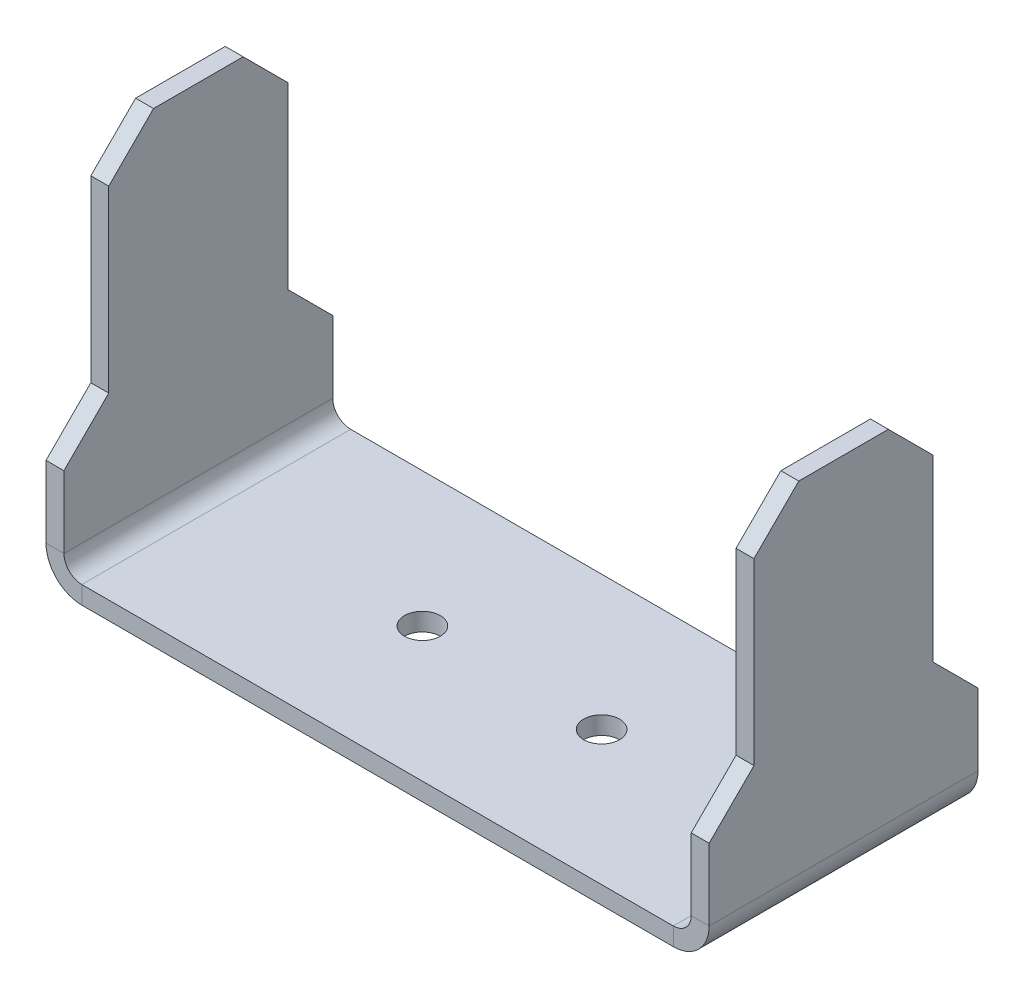
ISO-10303-21;
HEADER;
FILE_DESCRIPTION(('STEP AP214'),'2;1');
FILE_NAME('part.step','',(''),(''),'','','');
FILE_SCHEMA(('AUTOMOTIVE_DESIGN { 1 0 10303 214 1 1 1 1 }'));
ENDSEC;
DATA;
#1=APPLICATION_CONTEXT('core data for automotive mechanical design processes');
#2=APPLICATION_PROTOCOL_DEFINITION('international standard','automotive_design',2000,#1);
#3=PRODUCT_CONTEXT('',#1,'mechanical');
#4=PRODUCT('Part','Part','',(#3));
#5=PRODUCT_RELATED_PRODUCT_CATEGORY('part','',(#4));
#6=PRODUCT_DEFINITION_FORMATION('','',#4);
#7=PRODUCT_DEFINITION_CONTEXT('part definition',#1,'design');
#8=PRODUCT_DEFINITION('design','',#6,#7);
#9=PRODUCT_DEFINITION_SHAPE('','',#8);
#10=(LENGTH_UNIT() NAMED_UNIT(*) SI_UNIT(.MILLI.,.METRE.));
#11=(NAMED_UNIT(*) PLANE_ANGLE_UNIT() SI_UNIT($,.RADIAN.));
#12=(NAMED_UNIT(*) SI_UNIT($,.STERADIAN.) SOLID_ANGLE_UNIT());
#13=UNCERTAINTY_MEASURE_WITH_UNIT(LENGTH_MEASURE(1.E-05),#10,'distance_accuracy_value','');
#14=(GEOMETRIC_REPRESENTATION_CONTEXT(3) GLOBAL_UNCERTAINTY_ASSIGNED_CONTEXT((#13)) GLOBAL_UNIT_ASSIGNED_CONTEXT((#10,
#11,#12)) REPRESENTATION_CONTEXT('',''));
#15=CARTESIAN_POINT('',(0.,0.,0.));
#16=DIRECTION('',(0.,0.,1.));
#17=DIRECTION('',(1.,0.,0.));
#18=AXIS2_PLACEMENT_3D('',#15,#16,#17);
#19=CARTESIAN_POINT('',(-35.,0.,-15.));
#20=DIRECTION('',(0.,0.,-1.));
#21=DIRECTION('',(-1.,0.,0.));
#22=AXIS2_PLACEMENT_3D('',#19,#20,#21);
#23=PLANE('',#22);
#24=DIRECTION('',(0.,-1.,0.));
#25=VECTOR('',#24,1.);
#26=CARTESIAN_POINT('',(-33.,0.,-15.));
#27=LINE('',#26,#25);
#28=CARTESIAN_POINT('',(-33.,0.,-15.));
#29=VERTEX_POINT('',#28);
#30=CARTESIAN_POINT('',(-33.,-2.,-15.));
#31=VERTEX_POINT('',#30);
#32=EDGE_CURVE('E307',#29,#31,#27,.T.);
#33=ORIENTED_EDGE('',*,*,#32,.F.);
#34=DIRECTION('',(-1.,0.,0.));
#35=VECTOR('',#34,1.);
#36=CARTESIAN_POINT('',(-35.,0.,-15.));
#37=LINE('',#36,#35);
#38=CARTESIAN_POINT('',(33.,0.,-15.));
#39=VERTEX_POINT('',#38);
#40=EDGE_CURVE('E257',#39,#29,#37,.T.);
#41=ORIENTED_EDGE('',*,*,#40,.F.);
#42=DIRECTION('',(0.,-1.,0.));
#43=VECTOR('',#42,1.);
#44=CARTESIAN_POINT('',(33.,0.,-15.));
#45=LINE('',#44,#43);
#46=CARTESIAN_POINT('',(33.,-2.,-15.));
#47=VERTEX_POINT('',#46);
#48=EDGE_CURVE('E305',#39,#47,#45,.T.);
#49=ORIENTED_EDGE('',*,*,#48,.T.);
#50=DIRECTION('',(1.,0.,0.));
#51=VECTOR('',#50,1.);
#52=CARTESIAN_POINT('',(0.,-2.,-15.));
#53=LINE('',#52,#51);
#54=EDGE_CURVE('E229',#47,#31,#53,.F.);
#55=ORIENTED_EDGE('',*,*,#54,.T.);
#56=EDGE_LOOP('',(#33,#41,#49,#55));
#57=FACE_BOUND('',#56,.T.);
#58=ADVANCED_FACE('F39',(#57),#23,.T.);
#59=CARTESIAN_POINT('',(33.,2.,-15.));
#60=DIRECTION('',(0.,0.,1.));
#61=DIRECTION('',(1.,0.,0.));
#62=AXIS2_PLACEMENT_3D('',#59,#60,#61);
#63=PLANE('',#62);
#64=ORIENTED_EDGE('',*,*,#48,.F.);
#65=CARTESIAN_POINT('',(33.,2.,-15.));
#66=DIRECTION('',(0.,0.,-1.));
#67=DIRECTION('',(-1.,0.,0.));
#68=AXIS2_PLACEMENT_3D('',#65,#66,#67);
#69=CIRCLE('',#68,2.);
#70=CARTESIAN_POINT('',(35.,2.,-15.));
#71=VERTEX_POINT('',#70);
#72=EDGE_CURVE('E287',#39,#71,#69,.F.);
#73=ORIENTED_EDGE('',*,*,#72,.T.);
#74=DIRECTION('',(1.,0.,0.));
#75=VECTOR('',#74,1.);
#76=CARTESIAN_POINT('',(35.,2.,-15.));
#77=LINE('',#76,#75);
#78=CARTESIAN_POINT('',(37.,2.,-15.));
#79=VERTEX_POINT('',#78);
#80=EDGE_CURVE('E302',#71,#79,#77,.T.);
#81=ORIENTED_EDGE('',*,*,#80,.T.);
#82=CARTESIAN_POINT('',(33.,2.,-15.));
#83=DIRECTION('',(0.,0.,-1.));
#84=DIRECTION('',(-1.,0.,0.));
#85=AXIS2_PLACEMENT_3D('',#82,#83,#84);
#86=CIRCLE('',#85,4.);
#87=EDGE_CURVE('E243',#47,#79,#86,.F.);
#88=ORIENTED_EDGE('',*,*,#87,.F.);
#89=EDGE_LOOP('',(#64,#73,#81,#88));
#90=FACE_BOUND('',#89,.T.);
#91=ADVANCED_FACE('F478',(#90),#63,.F.);
#92=CARTESIAN_POINT('',(35.,40.,-15.));
#93=DIRECTION('',(0.,0.,-1.));
#94=DIRECTION('',(0.,-1.,0.));
#95=AXIS2_PLACEMENT_3D('',#92,#93,#94);
#96=PLANE('',#95);
#97=DIRECTION('',(1.,0.,0.));
#98=VECTOR('',#97,1.);
#99=CARTESIAN_POINT('',(-37.,10.,-15.));
#100=LINE('',#99,#98);
#101=CARTESIAN_POINT('',(35.,10.,-15.));
#102=VERTEX_POINT('',#101);
#103=CARTESIAN_POINT('',(37.,10.,-15.));
#104=VERTEX_POINT('',#103);
#105=EDGE_CURVE('E391',#102,#104,#100,.T.);
#106=ORIENTED_EDGE('',*,*,#105,.T.);
#107=DIRECTION('',(0.,1.,0.));
#108=VECTOR('',#107,1.);
#109=CARTESIAN_POINT('',(37.,40.,-15.));
#110=LINE('',#109,#108);
#111=EDGE_CURVE('E235',#104,#79,#110,.F.);
#112=ORIENTED_EDGE('',*,*,#111,.T.);
#113=ORIENTED_EDGE('',*,*,#80,.F.);
#114=DIRECTION('',(0.,-1.,0.));
#115=VECTOR('',#114,1.);
#116=CARTESIAN_POINT('',(35.,40.,-15.));
#117=LINE('',#116,#115);
#118=EDGE_CURVE('E250',#102,#71,#117,.T.);
#119=ORIENTED_EDGE('',*,*,#118,.F.);
#120=EDGE_LOOP('',(#106,#112,#113,#119));
#121=FACE_BOUND('',#120,.T.);
#122=ADVANCED_FACE('F483',(#121),#96,.T.);
#123=CARTESIAN_POINT('',(35.,40.,-15.));
#124=DIRECTION('',(0.,1.,0.));
#125=DIRECTION('',(0.,0.,-1.));
#126=AXIS2_PLACEMENT_3D('',#123,#124,#125);
#127=PLANE('',#126);
#128=DIRECTION('',(0.,0.,1.));
#129=VECTOR('',#128,1.);
#130=CARTESIAN_POINT('',(37.,40.,-15.));
#131=LINE('',#130,#129);
#132=CARTESIAN_POINT('',(37.,40.,4.99999999999999));
#133=VERTEX_POINT('',#132);
#134=CARTESIAN_POINT('',(37.,40.,-4.99999999999995));
#135=VERTEX_POINT('',#134);
#136=EDGE_CURVE('E230',#133,#135,#131,.F.);
#137=ORIENTED_EDGE('',*,*,#136,.T.);
#138=DIRECTION('',(-1.,0.,0.));
#139=VECTOR('',#138,1.);
#140=CARTESIAN_POINT('',(35.,40.,-4.99999999999995));
#141=LINE('',#140,#139);
#142=CARTESIAN_POINT('',(35.,40.,-4.99999999999995));
#143=VERTEX_POINT('',#142);
#144=EDGE_CURVE('E61',#135,#143,#141,.T.);
#145=ORIENTED_EDGE('',*,*,#144,.T.);
#146=DIRECTION('',(0.,0.,-1.));
#147=VECTOR('',#146,1.);
#148=CARTESIAN_POINT('',(35.,40.,-15.));
#149=LINE('',#148,#147);
#150=CARTESIAN_POINT('',(35.,40.,4.99999999999999));
#151=VERTEX_POINT('',#150);
#152=EDGE_CURVE('E252',#151,#143,#149,.T.);
#153=ORIENTED_EDGE('',*,*,#152,.F.);
#154=DIRECTION('',(1.,0.,0.));
#155=VECTOR('',#154,1.);
#156=CARTESIAN_POINT('',(37.,40.,4.99999999999999));
#157=LINE('',#156,#155);
#158=EDGE_CURVE('E346',#151,#133,#157,.T.);
#159=ORIENTED_EDGE('',*,*,#158,.T.);
#160=EDGE_LOOP('',(#137,#145,#153,#159));
#161=FACE_BOUND('',#160,.T.);
#162=ADVANCED_FACE('F366',(#161),#127,.T.);
#163=CARTESIAN_POINT('',(35.,40.,15.));
#164=DIRECTION('',(0.,0.,-1.));
#165=DIRECTION('',(0.,-1.,0.));
#166=AXIS2_PLACEMENT_3D('',#163,#164,#165);
#167=PLANE('',#166);
#168=DIRECTION('',(1.,0.,0.));
#169=VECTOR('',#168,1.);
#170=CARTESIAN_POINT('',(-37.,10.,15.));
#171=LINE('',#170,#169);
#172=CARTESIAN_POINT('',(35.,10.,15.));
#173=VERTEX_POINT('',#172);
#174=CARTESIAN_POINT('',(37.,10.,15.));
#175=VERTEX_POINT('',#174);
#176=EDGE_CURVE('E202',#173,#175,#171,.T.);
#177=ORIENTED_EDGE('',*,*,#176,.F.);
#178=DIRECTION('',(0.,-1.,0.));
#179=VECTOR('',#178,1.);
#180=CARTESIAN_POINT('',(35.,40.,15.));
#181=LINE('',#180,#179);
#182=CARTESIAN_POINT('',(35.,2.,15.));
#183=VERTEX_POINT('',#182);
#184=EDGE_CURVE('E255',#173,#183,#181,.T.);
#185=ORIENTED_EDGE('',*,*,#184,.T.);
#186=DIRECTION('',(1.,0.,0.));
#187=VECTOR('',#186,1.);
#188=CARTESIAN_POINT('',(35.,2.,15.));
#189=LINE('',#188,#187);
#190=CARTESIAN_POINT('',(37.,2.,15.));
#191=VERTEX_POINT('',#190);
#192=EDGE_CURVE('E227',#183,#191,#189,.T.);
#193=ORIENTED_EDGE('',*,*,#192,.T.);
#194=DIRECTION('',(0.,1.,0.));
#195=VECTOR('',#194,1.);
#196=CARTESIAN_POINT('',(37.,40.,15.));
#197=LINE('',#196,#195);
#198=EDGE_CURVE('E220',#175,#191,#197,.F.);
#199=ORIENTED_EDGE('',*,*,#198,.F.);
#200=EDGE_LOOP('',(#177,#185,#193,#199));
#201=FACE_BOUND('',#200,.T.);
#202=ADVANCED_FACE('F225',(#201),#167,.F.);
#203=CARTESIAN_POINT('',(33.,2.,15.));
#204=DIRECTION('',(0.,0.,1.));
#205=DIRECTION('',(1.,0.,0.));
#206=AXIS2_PLACEMENT_3D('',#203,#204,#205);
#207=PLANE('',#206);
#208=ORIENTED_EDGE('',*,*,#192,.F.);
#209=CARTESIAN_POINT('',(33.,2.,15.));
#210=DIRECTION('',(0.,0.,-1.));
#211=DIRECTION('',(-1.,0.,0.));
#212=AXIS2_PLACEMENT_3D('',#209,#210,#211);
#213=CIRCLE('',#212,2.);
#214=CARTESIAN_POINT('',(33.,0.,15.));
#215=VERTEX_POINT('',#214);
#216=EDGE_CURVE('E280',#183,#215,#213,.T.);
#217=ORIENTED_EDGE('',*,*,#216,.T.);
#218=DIRECTION('',(0.,-1.,0.));
#219=VECTOR('',#218,1.);
#220=CARTESIAN_POINT('',(33.,0.,15.));
#221=LINE('',#220,#219);
#222=CARTESIAN_POINT('',(33.,-2.,15.));
#223=VERTEX_POINT('',#222);
#224=EDGE_CURVE('E299',#215,#223,#221,.T.);
#225=ORIENTED_EDGE('',*,*,#224,.T.);
#226=CARTESIAN_POINT('',(33.,2.,15.));
#227=DIRECTION('',(0.,0.,-1.));
#228=DIRECTION('',(-1.,0.,0.));
#229=AXIS2_PLACEMENT_3D('',#226,#227,#228);
#230=CIRCLE('',#229,4.);
#231=EDGE_CURVE('E238',#191,#223,#230,.T.);
#232=ORIENTED_EDGE('',*,*,#231,.F.);
#233=EDGE_LOOP('',(#208,#217,#225,#232));
#234=FACE_BOUND('',#233,.T.);
#235=ADVANCED_FACE('F450',(#234),#207,.T.);
#236=CARTESIAN_POINT('',(-35.,0.,15.));
#237=DIRECTION('',(0.,0.,1.));
#238=DIRECTION('',(1.,0.,0.));
#239=AXIS2_PLACEMENT_3D('',#236,#237,#238);
#240=PLANE('',#239);
#241=ORIENTED_EDGE('',*,*,#224,.F.);
#242=DIRECTION('',(1.,0.,0.));
#243=VECTOR('',#242,1.);
#244=CARTESIAN_POINT('',(-35.,0.,15.));
#245=LINE('',#244,#243);
#246=CARTESIAN_POINT('',(-33.,0.,15.));
#247=VERTEX_POINT('',#246);
#248=EDGE_CURVE('E260',#247,#215,#245,.T.);
#249=ORIENTED_EDGE('',*,*,#248,.F.);
#250=DIRECTION('',(0.,-1.,0.));
#251=VECTOR('',#250,1.);
#252=CARTESIAN_POINT('',(-33.,0.,15.));
#253=LINE('',#252,#251);
#254=CARTESIAN_POINT('',(-33.,-2.,15.));
#255=VERTEX_POINT('',#254);
#256=EDGE_CURVE('E296',#247,#255,#253,.T.);
#257=ORIENTED_EDGE('',*,*,#256,.T.);
#258=DIRECTION('',(1.,0.,0.));
#259=VECTOR('',#258,1.);
#260=CARTESIAN_POINT('',(0.,-2.,15.));
#261=LINE('',#260,#259);
#262=EDGE_CURVE('E233',#255,#223,#261,.T.);
#263=ORIENTED_EDGE('',*,*,#262,.T.);
#264=EDGE_LOOP('',(#241,#249,#257,#263));
#265=FACE_BOUND('',#264,.T.);
#266=ADVANCED_FACE('F437',(#265),#240,.T.);
#267=CARTESIAN_POINT('',(-33.,2.,15.));
#268=DIRECTION('',(0.,0.,-1.));
#269=DIRECTION('',(-1.,0.,0.));
#270=AXIS2_PLACEMENT_3D('',#267,#268,#269);
#271=PLANE('',#270);
#272=ORIENTED_EDGE('',*,*,#256,.F.);
#273=CARTESIAN_POINT('',(-33.,2.,15.));
#274=DIRECTION('',(0.,0.,1.));
#275=DIRECTION('',(1.,0.,0.));
#276=AXIS2_PLACEMENT_3D('',#273,#274,#275);
#277=CIRCLE('',#276,2.);
#278=CARTESIAN_POINT('',(-35.,2.,15.));
#279=VERTEX_POINT('',#278);
#280=EDGE_CURVE('E277',#247,#279,#277,.F.);
#281=ORIENTED_EDGE('',*,*,#280,.T.);
#282=DIRECTION('',(-1.,0.,0.));
#283=VECTOR('',#282,1.);
#284=CARTESIAN_POINT('',(-35.,2.,15.));
#285=LINE('',#284,#283);
#286=CARTESIAN_POINT('',(-37.,2.,15.));
#287=VERTEX_POINT('',#286);
#288=EDGE_CURVE('E293',#279,#287,#285,.T.);
#289=ORIENTED_EDGE('',*,*,#288,.T.);
#290=CARTESIAN_POINT('',(-33.,2.,15.));
#291=DIRECTION('',(0.,0.,1.));
#292=DIRECTION('',(1.,0.,0.));
#293=AXIS2_PLACEMENT_3D('',#290,#291,#292);
#294=CIRCLE('',#293,4.);
#295=EDGE_CURVE('E249',#255,#287,#294,.F.);
#296=ORIENTED_EDGE('',*,*,#295,.F.);
#297=EDGE_LOOP('',(#272,#281,#289,#296));
#298=FACE_BOUND('',#297,.T.);
#299=ADVANCED_FACE('F467',(#298),#271,.F.);
#300=CARTESIAN_POINT('',(-35.,40.,15.));
#301=DIRECTION('',(0.,0.,1.));
#302=DIRECTION('',(0.,-1.,0.));
#303=AXIS2_PLACEMENT_3D('',#300,#301,#302);
#304=PLANE('',#303);
#305=CARTESIAN_POINT('',(-37.,10.,15.));
#306=VERTEX_POINT('',#305);
#307=CARTESIAN_POINT('',(-35.,9.99999999999967,15.));
#308=VERTEX_POINT('',#307);
#309=EDGE_CURVE('E213',#306,#308,#171,.T.);
#310=ORIENTED_EDGE('',*,*,#309,.F.);
#311=DIRECTION('',(0.,1.,0.));
#312=VECTOR('',#311,1.);
#313=CARTESIAN_POINT('',(-37.,40.,15.));
#314=LINE('',#313,#312);
#315=EDGE_CURVE('E431',#306,#287,#314,.F.);
#316=ORIENTED_EDGE('',*,*,#315,.T.);
#317=ORIENTED_EDGE('',*,*,#288,.F.);
#318=DIRECTION('',(0.,-1.,0.));
#319=VECTOR('',#318,1.);
#320=CARTESIAN_POINT('',(-35.,40.,15.));
#321=LINE('',#320,#319);
#322=EDGE_CURVE('E263',#308,#279,#321,.T.);
#323=ORIENTED_EDGE('',*,*,#322,.F.);
#324=EDGE_LOOP('',(#310,#316,#317,#323));
#325=FACE_BOUND('',#324,.T.);
#326=ADVANCED_FACE('F636',(#325),#304,.T.);
#327=CARTESIAN_POINT('',(-35.,40.,-15.));
#328=DIRECTION('',(0.,1.,0.));
#329=DIRECTION('',(0.,0.,1.));
#330=AXIS2_PLACEMENT_3D('',#327,#328,#329);
#331=PLANE('',#330);
#332=DIRECTION('',(0.,0.,1.));
#333=VECTOR('',#332,1.);
#334=CARTESIAN_POINT('',(-35.,40.,-15.));
#335=LINE('',#334,#333);
#336=CARTESIAN_POINT('',(-35.,40.,-4.99999999999995));
#337=VERTEX_POINT('',#336);
#338=CARTESIAN_POINT('',(-35.,40.,4.99999999999999));
#339=VERTEX_POINT('',#338);
#340=EDGE_CURVE('E265',#337,#339,#335,.T.);
#341=ORIENTED_EDGE('',*,*,#340,.F.);
#342=DIRECTION('',(-1.,0.,0.));
#343=VECTOR('',#342,1.);
#344=CARTESIAN_POINT('',(-37.,40.,-4.99999999999995));
#345=LINE('',#344,#343);
#346=CARTESIAN_POINT('',(-37.,40.,-4.99999999999995));
#347=VERTEX_POINT('',#346);
#348=EDGE_CURVE('E331',#337,#347,#345,.T.);
#349=ORIENTED_EDGE('',*,*,#348,.T.);
#350=DIRECTION('',(0.,0.,-1.));
#351=VECTOR('',#350,1.);
#352=CARTESIAN_POINT('',(-37.,40.,-15.));
#353=LINE('',#352,#351);
#354=CARTESIAN_POINT('',(-37.,40.,4.99999999999999));
#355=VERTEX_POINT('',#354);
#356=EDGE_CURVE('E428',#347,#355,#353,.F.);
#357=ORIENTED_EDGE('',*,*,#356,.T.);
#358=DIRECTION('',(1.,0.,0.));
#359=VECTOR('',#358,1.);
#360=CARTESIAN_POINT('',(-35.,40.,4.99999999999999));
#361=LINE('',#360,#359);
#362=EDGE_CURVE('E328',#355,#339,#361,.T.);
#363=ORIENTED_EDGE('',*,*,#362,.T.);
#364=EDGE_LOOP('',(#341,#349,#357,#363));
#365=FACE_BOUND('',#364,.T.);
#366=ADVANCED_FACE('F632',(#365),#331,.T.);
#367=CARTESIAN_POINT('',(-35.,40.,-15.));
#368=DIRECTION('',(0.,0.,1.));
#369=DIRECTION('',(0.,-1.,0.));
#370=AXIS2_PLACEMENT_3D('',#367,#368,#369);
#371=PLANE('',#370);
#372=CARTESIAN_POINT('',(-37.,10.,-15.));
#373=VERTEX_POINT('',#372);
#374=CARTESIAN_POINT('',(-35.,10.,-15.));
#375=VERTEX_POINT('',#374);
#376=EDGE_CURVE('E394',#373,#375,#100,.T.);
#377=ORIENTED_EDGE('',*,*,#376,.T.);
#378=DIRECTION('',(0.,-1.,0.));
#379=VECTOR('',#378,1.);
#380=CARTESIAN_POINT('',(-35.,40.,-15.));
#381=LINE('',#380,#379);
#382=CARTESIAN_POINT('',(-35.,2.,-15.));
#383=VERTEX_POINT('',#382);
#384=EDGE_CURVE('E268',#375,#383,#381,.T.);
#385=ORIENTED_EDGE('',*,*,#384,.T.);
#386=DIRECTION('',(-1.,0.,0.));
#387=VECTOR('',#386,1.);
#388=CARTESIAN_POINT('',(-35.,2.,-15.));
#389=LINE('',#388,#387);
#390=CARTESIAN_POINT('',(-37.,2.,-15.));
#391=VERTEX_POINT('',#390);
#392=EDGE_CURVE('E297',#383,#391,#389,.T.);
#393=ORIENTED_EDGE('',*,*,#392,.T.);
#394=DIRECTION('',(0.,1.,0.));
#395=VECTOR('',#394,1.);
#396=CARTESIAN_POINT('',(-37.,40.,-15.));
#397=LINE('',#396,#395);
#398=EDGE_CURVE('E420',#373,#391,#397,.F.);
#399=ORIENTED_EDGE('',*,*,#398,.F.);
#400=EDGE_LOOP('',(#377,#385,#393,#399));
#401=FACE_BOUND('',#400,.T.);
#402=ADVANCED_FACE('F514',(#401),#371,.F.);
#403=CARTESIAN_POINT('',(-33.,2.,-15.));
#404=DIRECTION('',(0.,0.,-1.));
#405=DIRECTION('',(-1.,0.,0.));
#406=AXIS2_PLACEMENT_3D('',#403,#404,#405);
#407=PLANE('',#406);
#408=CARTESIAN_POINT('',(-33.,2.,-15.));
#409=DIRECTION('',(0.,0.,1.));
#410=DIRECTION('',(1.,0.,0.));
#411=AXIS2_PLACEMENT_3D('',#408,#409,#410);
#412=CIRCLE('',#411,2.);
#413=EDGE_CURVE('E253',#383,#29,#412,.T.);
#414=ORIENTED_EDGE('',*,*,#413,.T.);
#415=ORIENTED_EDGE('',*,*,#32,.T.);
#416=CARTESIAN_POINT('',(-33.,2.,-15.));
#417=DIRECTION('',(0.,0.,1.));
#418=DIRECTION('',(1.,0.,0.));
#419=AXIS2_PLACEMENT_3D('',#416,#417,#418);
#420=CIRCLE('',#419,4.);
#421=EDGE_CURVE('E242',#391,#31,#420,.T.);
#422=ORIENTED_EDGE('',*,*,#421,.F.);
#423=ORIENTED_EDGE('',*,*,#392,.F.);
#424=EDGE_LOOP('',(#414,#415,#422,#423));
#425=FACE_BOUND('',#424,.T.);
#426=ADVANCED_FACE('F510',(#425),#407,.T.);
#427=CARTESIAN_POINT('',(-37.,40.,-15.));
#428=DIRECTION('',(1.,0.,0.));
#429=DIRECTION('',(0.,0.,-1.));
#430=AXIS2_PLACEMENT_3D('',#427,#428,#429);
#431=PLANE('',#430);
#432=ORIENTED_EDGE('',*,*,#356,.F.);
#433=DIRECTION('',(0.,-0.707106781186546,-0.707106781186549));
#434=VECTOR('',#433,1.);
#435=CARTESIAN_POINT('',(-37.,35.,-10.));
#436=LINE('',#435,#434);
#437=CARTESIAN_POINT('',(-37.,35.,-10.));
#438=VERTEX_POINT('',#437);
#439=EDGE_CURVE('E335',#347,#438,#436,.T.);
#440=ORIENTED_EDGE('',*,*,#439,.T.);
#441=DIRECTION('',(0.,-1.,0.));
#442=VECTOR('',#441,1.);
#443=CARTESIAN_POINT('',(-37.,15.0000000000001,-10.));
#444=LINE('',#443,#442);
#445=CARTESIAN_POINT('',(-37.,15.0000000000001,-10.));
#446=VERTEX_POINT('',#445);
#447=EDGE_CURVE('E389',#438,#446,#444,.T.);
#448=ORIENTED_EDGE('',*,*,#447,.T.);
#449=DIRECTION('',(0.,-0.707106781186551,-0.707106781186544));
#450=VECTOR('',#449,1.);
#451=CARTESIAN_POINT('',(-37.,10.,-15.));
#452=LINE('',#451,#450);
#453=EDGE_CURVE('E386',#446,#373,#452,.T.);
#454=ORIENTED_EDGE('',*,*,#453,.T.);
#455=ORIENTED_EDGE('',*,*,#398,.T.);
#456=DIRECTION('',(0.,0.,-1.));
#457=VECTOR('',#456,1.);
#458=CARTESIAN_POINT('',(-37.,2.,-15.));
#459=LINE('',#458,#457);
#460=EDGE_CURVE('E416',#391,#287,#459,.F.);
#461=ORIENTED_EDGE('',*,*,#460,.T.);
#462=ORIENTED_EDGE('',*,*,#315,.F.);
#463=DIRECTION('',(0.,0.707106781186551,-0.707106781186544));
#464=VECTOR('',#463,1.);
#465=CARTESIAN_POINT('',(-37.,10.,15.));
#466=LINE('',#465,#464);
#467=CARTESIAN_POINT('',(-37.,15.0000000000001,10.));
#468=VERTEX_POINT('',#467);
#469=EDGE_CURVE('E372',#306,#468,#466,.T.);
#470=ORIENTED_EDGE('',*,*,#469,.T.);
#471=DIRECTION('',(0.,1.,0.));
#472=VECTOR('',#471,1.);
#473=CARTESIAN_POINT('',(-37.,15.0000000000001,10.));
#474=LINE('',#473,#472);
#475=CARTESIAN_POINT('',(-37.,35.,10.));
#476=VERTEX_POINT('',#475);
#477=EDGE_CURVE('E214',#468,#476,#474,.T.);
#478=ORIENTED_EDGE('',*,*,#477,.T.);
#479=DIRECTION('',(0.,0.707106781186549,-0.707106781186547));
#480=VECTOR('',#479,1.);
#481=CARTESIAN_POINT('',(-37.,40.,4.99999999999999));
#482=LINE('',#481,#480);
#483=EDGE_CURVE('E333',#476,#355,#482,.T.);
#484=ORIENTED_EDGE('',*,*,#483,.T.);
#485=EDGE_LOOP('',(#432,#440,#448,#454,#455,#461,#462,#470,#478,#484));
#486=FACE_BOUND('',#485,.T.);
#487=ADVANCED_FACE('F513',(#486),#431,.F.);
#488=CARTESIAN_POINT('',(0.,-2.,0.));
#489=DIRECTION('',(0.,1.,0.));
#490=DIRECTION('',(0.,0.,1.));
#491=AXIS2_PLACEMENT_3D('',#488,#489,#490);
#492=PLANE('',#491);
#493=CARTESIAN_POINT('',(-10.,-2.,0.));
#494=DIRECTION('',(0.,1.,0.));
#495=DIRECTION('',(0.,0.,1.));
#496=AXIS2_PLACEMENT_3D('',#493,#494,#495);
#497=CIRCLE('',#496,2.);
#498=CARTESIAN_POINT('',(-10.,-2.,2.));
#499=VERTEX_POINT('',#498);
#500=EDGE_CURVE('E290',#499,#499,#497,.F.);
#501=ORIENTED_EDGE('',*,*,#500,.F.);
#502=EDGE_LOOP('',(#501));
#503=FACE_BOUND('',#502,.T.);
#504=CARTESIAN_POINT('',(10.,-2.,0.));
#505=DIRECTION('',(0.,1.,0.));
#506=DIRECTION('',(0.,0.,1.));
#507=AXIS2_PLACEMENT_3D('',#504,#505,#506);
#508=CIRCLE('',#507,2.);
#509=CARTESIAN_POINT('',(10.,-2.,2.));
#510=VERTEX_POINT('',#509);
#511=EDGE_CURVE('E409',#510,#510,#508,.F.);
#512=ORIENTED_EDGE('',*,*,#511,.F.);
#513=EDGE_LOOP('',(#512));
#514=FACE_BOUND('',#513,.T.);
#515=ORIENTED_EDGE('',*,*,#54,.F.);
#516=DIRECTION('',(0.,0.,1.));
#517=VECTOR('',#516,1.);
#518=CARTESIAN_POINT('',(33.,-2.,0.));
#519=LINE('',#518,#517);
#520=EDGE_CURVE('E312',#47,#223,#519,.T.);
#521=ORIENTED_EDGE('',*,*,#520,.T.);
#522=ORIENTED_EDGE('',*,*,#262,.F.);
#523=DIRECTION('',(0.,0.,1.));
#524=VECTOR('',#523,1.);
#525=CARTESIAN_POINT('',(-33.,-2.,0.));
#526=LINE('',#525,#524);
#527=EDGE_CURVE('E419',#255,#31,#526,.F.);
#528=ORIENTED_EDGE('',*,*,#527,.T.);
#529=EDGE_LOOP('',(#515,#521,#522,#528));
#530=FACE_BOUND('',#529,.T.);
#531=ADVANCED_FACE('F443',(#503,#514,#530),#492,.F.);
#532=CARTESIAN_POINT('',(37.,40.,-15.));
#533=DIRECTION('',(-1.,0.,0.));
#534=DIRECTION('',(0.,0.,1.));
#535=AXIS2_PLACEMENT_3D('',#532,#533,#534);
#536=PLANE('',#535);
#537=DIRECTION('',(0.,-1.,0.));
#538=VECTOR('',#537,1.);
#539=CARTESIAN_POINT('',(37.,15.0000000000001,-10.));
#540=LINE('',#539,#538);
#541=CARTESIAN_POINT('',(37.,35.,-10.));
#542=VERTEX_POINT('',#541);
#543=CARTESIAN_POINT('',(37.,15.0000000000001,-10.));
#544=VERTEX_POINT('',#543);
#545=EDGE_CURVE('E365',#542,#544,#540,.T.);
#546=ORIENTED_EDGE('',*,*,#545,.F.);
#547=DIRECTION('',(0.,0.707106781186546,0.707106781186549));
#548=VECTOR('',#547,1.);
#549=CARTESIAN_POINT('',(37.,35.,-10.));
#550=LINE('',#549,#548);
#551=EDGE_CURVE('E344',#542,#135,#550,.T.);
#552=ORIENTED_EDGE('',*,*,#551,.T.);
#553=ORIENTED_EDGE('',*,*,#136,.F.);
#554=DIRECTION('',(0.,-0.707106781186549,0.707106781186547));
#555=VECTOR('',#554,1.);
#556=CARTESIAN_POINT('',(37.,40.,4.99999999999999));
#557=LINE('',#556,#555);
#558=CARTESIAN_POINT('',(37.,35.,10.));
#559=VERTEX_POINT('',#558);
#560=EDGE_CURVE('E342',#133,#559,#557,.T.);
#561=ORIENTED_EDGE('',*,*,#560,.T.);
#562=DIRECTION('',(0.,1.,0.));
#563=VECTOR('',#562,1.);
#564=CARTESIAN_POINT('',(37.,15.0000000000001,10.));
#565=LINE('',#564,#563);
#566=CARTESIAN_POINT('',(37.,15.0000000000001,10.));
#567=VERTEX_POINT('',#566);
#568=EDGE_CURVE('E222',#567,#559,#565,.T.);
#569=ORIENTED_EDGE('',*,*,#568,.F.);
#570=DIRECTION('',(0.,0.707106781186551,-0.707106781186544));
#571=VECTOR('',#570,1.);
#572=CARTESIAN_POINT('',(37.,10.,15.));
#573=LINE('',#572,#571);
#574=EDGE_CURVE('E206',#175,#567,#573,.T.);
#575=ORIENTED_EDGE('',*,*,#574,.F.);
#576=ORIENTED_EDGE('',*,*,#198,.T.);
#577=DIRECTION('',(0.,0.,1.));
#578=VECTOR('',#577,1.);
#579=CARTESIAN_POINT('',(37.,2.,-15.));
#580=LINE('',#579,#578);
#581=EDGE_CURVE('E423',#191,#79,#580,.F.);
#582=ORIENTED_EDGE('',*,*,#581,.T.);
#583=ORIENTED_EDGE('',*,*,#111,.F.);
#584=DIRECTION('',(0.,-0.707106781186551,-0.707106781186544));
#585=VECTOR('',#584,1.);
#586=CARTESIAN_POINT('',(37.,10.,-15.));
#587=LINE('',#586,#585);
#588=EDGE_CURVE('E383',#544,#104,#587,.T.);
#589=ORIENTED_EDGE('',*,*,#588,.F.);
#590=EDGE_LOOP('',(#546,#552,#553,#561,#569,#575,#576,#582,#583,#589));
#591=FACE_BOUND('',#590,.T.);
#592=ADVANCED_FACE('F218',(#591),#536,.F.);
#593=CARTESIAN_POINT('',(-33.,2.,-15.));
#594=DIRECTION('',(0.,0.,1.));
#595=DIRECTION('',(1.,0.,0.));
#596=AXIS2_PLACEMENT_3D('',#593,#594,#595);
#597=CYLINDRICAL_SURFACE('',#596,4.);
#598=ORIENTED_EDGE('',*,*,#421,.T.);
#599=ORIENTED_EDGE('',*,*,#527,.F.);
#600=ORIENTED_EDGE('',*,*,#295,.T.);
#601=ORIENTED_EDGE('',*,*,#460,.F.);
#602=EDGE_LOOP('',(#598,#599,#600,#601));
#603=FACE_BOUND('',#602,.T.);
#604=ADVANCED_FACE('F472',(#603),#597,.T.);
#605=CARTESIAN_POINT('',(33.,2.,-15.));
#606=DIRECTION('',(0.,0.,-1.));
#607=DIRECTION('',(-1.,0.,0.));
#608=AXIS2_PLACEMENT_3D('',#605,#606,#607);
#609=CYLINDRICAL_SURFACE('',#608,4.);
#610=ORIENTED_EDGE('',*,*,#231,.T.);
#611=ORIENTED_EDGE('',*,*,#520,.F.);
#612=ORIENTED_EDGE('',*,*,#87,.T.);
#613=ORIENTED_EDGE('',*,*,#581,.F.);
#614=EDGE_LOOP('',(#610,#611,#612,#613));
#615=FACE_BOUND('',#614,.T.);
#616=ADVANCED_FACE('F447',(#615),#609,.T.);
#617=CARTESIAN_POINT('',(-35.,40.,-15.));
#618=DIRECTION('',(1.,0.,0.));
#619=DIRECTION('',(0.,0.,-1.));
#620=AXIS2_PLACEMENT_3D('',#617,#618,#619);
#621=PLANE('',#620);
#622=DIRECTION('',(0.,-1.,0.));
#623=VECTOR('',#622,1.);
#624=CARTESIAN_POINT('',(-35.,40.,-10.));
#625=LINE('',#624,#623);
#626=CARTESIAN_POINT('',(-35.,35.,-10.));
#627=VERTEX_POINT('',#626);
#628=CARTESIAN_POINT('',(-35.,15.0000000000001,-10.));
#629=VERTEX_POINT('',#628);
#630=EDGE_CURVE('E381',#627,#629,#625,.T.);
#631=ORIENTED_EDGE('',*,*,#630,.F.);
#632=DIRECTION('',(0.,0.707106781186546,0.707106781186549));
#633=VECTOR('',#632,1.);
#634=CARTESIAN_POINT('',(-35.,35.,-10.));
#635=LINE('',#634,#633);
#636=EDGE_CURVE('E326',#627,#337,#635,.T.);
#637=ORIENTED_EDGE('',*,*,#636,.T.);
#638=ORIENTED_EDGE('',*,*,#340,.T.);
#639=DIRECTION('',(0.,-0.707106781186549,0.707106781186547));
#640=VECTOR('',#639,1.);
#641=CARTESIAN_POINT('',(-35.,50.,-4.99999999999997));
#642=LINE('',#641,#640);
#643=CARTESIAN_POINT('',(-35.,35.,10.));
#644=VERTEX_POINT('',#643);
#645=EDGE_CURVE('E324',#339,#644,#642,.T.);
#646=ORIENTED_EDGE('',*,*,#645,.T.);
#647=DIRECTION('',(0.,1.,0.));
#648=VECTOR('',#647,1.);
#649=CARTESIAN_POINT('',(-35.,40.,10.));
#650=LINE('',#649,#648);
#651=CARTESIAN_POINT('',(-35.,15.0000000000001,10.));
#652=VERTEX_POINT('',#651);
#653=EDGE_CURVE('E402',#652,#644,#650,.T.);
#654=ORIENTED_EDGE('',*,*,#653,.F.);
#655=DIRECTION('',(0.,0.707106781186551,-0.707106781186544));
#656=VECTOR('',#655,1.);
#657=CARTESIAN_POINT('',(-35.,40.,-15.));
#658=LINE('',#657,#656);
#659=EDGE_CURVE('E400',#308,#652,#658,.T.);
#660=ORIENTED_EDGE('',*,*,#659,.F.);
#661=ORIENTED_EDGE('',*,*,#322,.T.);
#662=DIRECTION('',(0.,0.,1.));
#663=VECTOR('',#662,1.);
#664=CARTESIAN_POINT('',(-35.,2.,-15.));
#665=LINE('',#664,#663);
#666=EDGE_CURVE('E270',#383,#279,#665,.T.);
#667=ORIENTED_EDGE('',*,*,#666,.F.);
#668=ORIENTED_EDGE('',*,*,#384,.F.);
#669=DIRECTION('',(0.,-0.707106781186551,-0.707106781186544));
#670=VECTOR('',#669,1.);
#671=CARTESIAN_POINT('',(-35.,25.0000000000002,0.));
#672=LINE('',#671,#670);
#673=EDGE_CURVE('E398',#629,#375,#672,.T.);
#674=ORIENTED_EDGE('',*,*,#673,.F.);
#675=EDGE_LOOP('',(#631,#637,#638,#646,#654,#660,#661,#667,#668,#674));
#676=FACE_BOUND('',#675,.T.);
#677=ADVANCED_FACE('F608',(#676),#621,.T.);
#678=CARTESIAN_POINT('',(0.,0.,0.));
#679=DIRECTION('',(0.,1.,0.));
#680=DIRECTION('',(0.,0.,1.));
#681=AXIS2_PLACEMENT_3D('',#678,#679,#680);
#682=PLANE('',#681);
#683=CARTESIAN_POINT('',(-10.,0.,0.));
#684=DIRECTION('',(0.,1.,0.));
#685=DIRECTION('',(0.,0.,1.));
#686=AXIS2_PLACEMENT_3D('',#683,#684,#685);
#687=CIRCLE('',#686,2.);
#688=CARTESIAN_POINT('',(-10.,0.,2.));
#689=VERTEX_POINT('',#688);
#690=EDGE_CURVE('E406',#689,#689,#687,.T.);
#691=ORIENTED_EDGE('',*,*,#690,.F.);
#692=EDGE_LOOP('',(#691));
#693=FACE_BOUND('',#692,.T.);
#694=CARTESIAN_POINT('',(10.,0.,0.));
#695=DIRECTION('',(0.,1.,0.));
#696=DIRECTION('',(0.,0.,-1.));
#697=AXIS2_PLACEMENT_3D('',#694,#695,#696);
#698=CIRCLE('',#697,2.);
#699=CARTESIAN_POINT('',(10.,0.,-2.));
#700=VERTEX_POINT('',#699);
#701=EDGE_CURVE('E405',#700,#700,#698,.T.);
#702=ORIENTED_EDGE('',*,*,#701,.F.);
#703=EDGE_LOOP('',(#702));
#704=FACE_BOUND('',#703,.T.);
#705=ORIENTED_EDGE('',*,*,#40,.T.);
#706=DIRECTION('',(0.,0.,1.));
#707=VECTOR('',#706,1.);
#708=CARTESIAN_POINT('',(-33.,0.,0.));
#709=LINE('',#708,#707);
#710=EDGE_CURVE('E273',#247,#29,#709,.F.);
#711=ORIENTED_EDGE('',*,*,#710,.F.);
#712=ORIENTED_EDGE('',*,*,#248,.T.);
#713=DIRECTION('',(0.,0.,-1.));
#714=VECTOR('',#713,1.);
#715=CARTESIAN_POINT('',(33.,0.,0.));
#716=LINE('',#715,#714);
#717=EDGE_CURVE('E245',#39,#215,#716,.F.);
#718=ORIENTED_EDGE('',*,*,#717,.F.);
#719=EDGE_LOOP('',(#705,#711,#712,#718));
#720=FACE_BOUND('',#719,.T.);
#721=ADVANCED_FACE('F460',(#693,#704,#720),#682,.T.);
#722=CARTESIAN_POINT('',(35.,40.,-15.));
#723=DIRECTION('',(-1.,0.,0.));
#724=DIRECTION('',(0.,0.,1.));
#725=AXIS2_PLACEMENT_3D('',#722,#723,#724);
#726=PLANE('',#725);
#727=ORIENTED_EDGE('',*,*,#152,.T.);
#728=DIRECTION('',(0.,-0.707106781186546,-0.707106781186549));
#729=VECTOR('',#728,1.);
#730=CARTESIAN_POINT('',(35.,35.,-10.));
#731=LINE('',#730,#729);
#732=CARTESIAN_POINT('',(35.,35.,-10.));
#733=VERTEX_POINT('',#732);
#734=EDGE_CURVE('E48',#143,#733,#731,.T.);
#735=ORIENTED_EDGE('',*,*,#734,.T.);
#736=DIRECTION('',(0.,1.,0.));
#737=VECTOR('',#736,1.);
#738=CARTESIAN_POINT('',(35.,40.,-10.));
#739=LINE('',#738,#737);
#740=CARTESIAN_POINT('',(35.,15.0000000000001,-10.));
#741=VERTEX_POINT('',#740);
#742=EDGE_CURVE('E309',#741,#733,#739,.T.);
#743=ORIENTED_EDGE('',*,*,#742,.F.);
#744=DIRECTION('',(0.,0.707106781186551,0.707106781186544));
#745=VECTOR('',#744,1.);
#746=CARTESIAN_POINT('',(35.,25.0000000000002,0.));
#747=LINE('',#746,#745);
#748=EDGE_CURVE('E315',#102,#741,#747,.T.);
#749=ORIENTED_EDGE('',*,*,#748,.F.);
#750=ORIENTED_EDGE('',*,*,#118,.T.);
#751=DIRECTION('',(0.,0.,-1.));
#752=VECTOR('',#751,1.);
#753=CARTESIAN_POINT('',(35.,2.,-15.));
#754=LINE('',#753,#752);
#755=EDGE_CURVE('E276',#183,#71,#754,.T.);
#756=ORIENTED_EDGE('',*,*,#755,.F.);
#757=ORIENTED_EDGE('',*,*,#184,.F.);
#758=DIRECTION('',(0.,-0.707106781186551,0.707106781186544));
#759=VECTOR('',#758,1.);
#760=CARTESIAN_POINT('',(35.,40.,-15.));
#761=LINE('',#760,#759);
#762=CARTESIAN_POINT('',(35.,14.9999999999997,10.));
#763=VERTEX_POINT('',#762);
#764=EDGE_CURVE('E209',#763,#173,#761,.T.);
#765=ORIENTED_EDGE('',*,*,#764,.F.);
#766=DIRECTION('',(0.,-1.,0.));
#767=VECTOR('',#766,1.);
#768=CARTESIAN_POINT('',(35.,40.,10.));
#769=LINE('',#768,#767);
#770=CARTESIAN_POINT('',(35.,35.,10.));
#771=VERTEX_POINT('',#770);
#772=EDGE_CURVE('E319',#771,#763,#769,.T.);
#773=ORIENTED_EDGE('',*,*,#772,.F.);
#774=DIRECTION('',(0.,0.707106781186549,-0.707106781186547));
#775=VECTOR('',#774,1.);
#776=CARTESIAN_POINT('',(35.,50.,-4.99999999999997));
#777=LINE('',#776,#775);
#778=EDGE_CURVE('E350',#771,#151,#777,.T.);
#779=ORIENTED_EDGE('',*,*,#778,.T.);
#780=EDGE_LOOP('',(#727,#735,#743,#749,#750,#756,#757,#765,#773,#779));
#781=FACE_BOUND('',#780,.T.);
#782=ADVANCED_FACE('F354',(#781),#726,.T.);
#783=CARTESIAN_POINT('',(-33.,2.,-15.));
#784=DIRECTION('',(0.,0.,1.));
#785=DIRECTION('',(1.,0.,0.));
#786=AXIS2_PLACEMENT_3D('',#783,#784,#785);
#787=CYLINDRICAL_SURFACE('',#786,2.);
#788=ORIENTED_EDGE('',*,*,#413,.F.);
#789=ORIENTED_EDGE('',*,*,#666,.T.);
#790=ORIENTED_EDGE('',*,*,#280,.F.);
#791=ORIENTED_EDGE('',*,*,#710,.T.);
#792=EDGE_LOOP('',(#788,#789,#790,#791));
#793=FACE_BOUND('',#792,.T.);
#794=ADVANCED_FACE('F464',(#793),#787,.F.);
#795=CARTESIAN_POINT('',(33.,2.,-15.));
#796=DIRECTION('',(0.,0.,-1.));
#797=DIRECTION('',(-1.,0.,0.));
#798=AXIS2_PLACEMENT_3D('',#795,#796,#797);
#799=CYLINDRICAL_SURFACE('',#798,2.);
#800=ORIENTED_EDGE('',*,*,#216,.F.);
#801=ORIENTED_EDGE('',*,*,#755,.T.);
#802=ORIENTED_EDGE('',*,*,#72,.F.);
#803=ORIENTED_EDGE('',*,*,#717,.T.);
#804=EDGE_LOOP('',(#800,#801,#802,#803));
#805=FACE_BOUND('',#804,.T.);
#806=ADVANCED_FACE('F454',(#805),#799,.F.);
#807=CARTESIAN_POINT('',(10.,-2.001,0.));
#808=DIRECTION('',(0.,1.,0.));
#809=DIRECTION('',(0.,0.,1.));
#810=AXIS2_PLACEMENT_3D('',#807,#808,#809);
#811=CYLINDRICAL_SURFACE('',#810,2.);
#812=ORIENTED_EDGE('',*,*,#701,.T.);
#813=EDGE_LOOP('',(#812));
#814=FACE_BOUND('',#813,.T.);
#815=ORIENTED_EDGE('',*,*,#511,.T.);
#816=EDGE_LOOP('',(#815));
#817=FACE_BOUND('',#816,.T.);
#818=ADVANCED_FACE('F699',(#814,#817),#811,.F.);
#819=CARTESIAN_POINT('',(-10.,-2.001,0.));
#820=DIRECTION('',(0.,1.,0.));
#821=DIRECTION('',(0.,0.,1.));
#822=AXIS2_PLACEMENT_3D('',#819,#820,#821);
#823=CYLINDRICAL_SURFACE('',#822,2.);
#824=ORIENTED_EDGE('',*,*,#690,.T.);
#825=EDGE_LOOP('',(#824));
#826=FACE_BOUND('',#825,.T.);
#827=ORIENTED_EDGE('',*,*,#500,.T.);
#828=EDGE_LOOP('',(#827));
#829=FACE_BOUND('',#828,.T.);
#830=ADVANCED_FACE('F496',(#826,#829),#823,.F.);
#831=CARTESIAN_POINT('',(-37.,15.0000000000001,-10.));
#832=DIRECTION('',(0.,0.,1.));
#833=DIRECTION('',(1.,0.,0.));
#834=AXIS2_PLACEMENT_3D('',#831,#832,#833);
#835=PLANE('',#834);
#836=ORIENTED_EDGE('',*,*,#742,.T.);
#837=DIRECTION('',(1.,0.,0.));
#838=VECTOR('',#837,1.);
#839=CARTESIAN_POINT('',(37.,35.,-10.));
#840=LINE('',#839,#838);
#841=EDGE_CURVE('E339',#733,#542,#840,.T.);
#842=ORIENTED_EDGE('',*,*,#841,.T.);
#843=ORIENTED_EDGE('',*,*,#545,.T.);
#844=DIRECTION('',(1.,0.,0.));
#845=VECTOR('',#844,1.);
#846=CARTESIAN_POINT('',(-37.,15.0000000000001,-10.));
#847=LINE('',#846,#845);
#848=EDGE_CURVE('E361',#741,#544,#847,.T.);
#849=ORIENTED_EDGE('',*,*,#848,.F.);
#850=EDGE_LOOP('',(#836,#842,#843,#849));
#851=FACE_BOUND('',#850,.T.);
#852=ADVANCED_FACE('F359',(#851),#835,.F.);
#853=CARTESIAN_POINT('',(-37.,10.,-15.));
#854=DIRECTION('',(0.,-0.707106781186544,0.707106781186552));
#855=DIRECTION('',(0.,-0.707106781186551,-0.707106781186544));
#856=AXIS2_PLACEMENT_3D('',#853,#854,#855);
#857=PLANE('',#856);
#858=ORIENTED_EDGE('',*,*,#748,.T.);
#859=ORIENTED_EDGE('',*,*,#848,.T.);
#860=ORIENTED_EDGE('',*,*,#588,.T.);
#861=ORIENTED_EDGE('',*,*,#105,.F.);
#862=EDGE_LOOP('',(#858,#859,#860,#861));
#863=FACE_BOUND('',#862,.T.);
#864=ADVANCED_FACE('F486',(#863),#857,.F.);
#865=CARTESIAN_POINT('',(-37.,10.,15.));
#866=DIRECTION('',(0.,-0.707106781186544,-0.707106781186552));
#867=DIRECTION('',(0.,0.707106781186551,-0.707106781186544));
#868=AXIS2_PLACEMENT_3D('',#865,#866,#867);
#869=PLANE('',#868);
#870=ORIENTED_EDGE('',*,*,#764,.T.);
#871=ORIENTED_EDGE('',*,*,#176,.T.);
#872=ORIENTED_EDGE('',*,*,#574,.T.);
#873=DIRECTION('',(1.,0.,0.));
#874=VECTOR('',#873,1.);
#875=CARTESIAN_POINT('',(-37.,15.0000000000001,10.));
#876=LINE('',#875,#874);
#877=EDGE_CURVE('E371',#763,#567,#876,.T.);
#878=ORIENTED_EDGE('',*,*,#877,.F.);
#879=EDGE_LOOP('',(#870,#871,#872,#878));
#880=FACE_BOUND('',#879,.T.);
#881=ADVANCED_FACE('F204',(#880),#869,.F.);
#882=CARTESIAN_POINT('',(-37.,15.0000000000001,10.));
#883=DIRECTION('',(0.,0.,-1.));
#884=DIRECTION('',(-1.,0.,0.));
#885=AXIS2_PLACEMENT_3D('',#882,#883,#884);
#886=PLANE('',#885);
#887=ORIENTED_EDGE('',*,*,#568,.T.);
#888=DIRECTION('',(-1.,0.,0.));
#889=VECTOR('',#888,1.);
#890=CARTESIAN_POINT('',(35.,35.,10.));
#891=LINE('',#890,#889);
#892=EDGE_CURVE('E11',#559,#771,#891,.T.);
#893=ORIENTED_EDGE('',*,*,#892,.T.);
#894=ORIENTED_EDGE('',*,*,#772,.T.);
#895=ORIENTED_EDGE('',*,*,#877,.T.);
#896=EDGE_LOOP('',(#887,#893,#894,#895));
#897=FACE_BOUND('',#896,.T.);
#898=ADVANCED_FACE('F370',(#897),#886,.F.);
#899=ORIENTED_EDGE('',*,*,#673,.T.);
#900=ORIENTED_EDGE('',*,*,#376,.F.);
#901=ORIENTED_EDGE('',*,*,#453,.F.);
#902=EDGE_CURVE('E223',#446,#629,#847,.T.);
#903=ORIENTED_EDGE('',*,*,#902,.T.);
#904=EDGE_LOOP('',(#899,#900,#901,#903));
#905=FACE_BOUND('',#904,.T.);
#906=ADVANCED_FACE('F489',(#905),#857,.F.);
#907=ORIENTED_EDGE('',*,*,#447,.F.);
#908=DIRECTION('',(1.,0.,0.));
#909=VECTOR('',#908,1.);
#910=CARTESIAN_POINT('',(-35.,35.,-10.));
#911=LINE('',#910,#909);
#912=EDGE_CURVE('E321',#438,#627,#911,.T.);
#913=ORIENTED_EDGE('',*,*,#912,.T.);
#914=ORIENTED_EDGE('',*,*,#630,.T.);
#915=ORIENTED_EDGE('',*,*,#902,.F.);
#916=EDGE_LOOP('',(#907,#913,#914,#915));
#917=FACE_BOUND('',#916,.T.);
#918=ADVANCED_FACE('F498',(#917),#835,.F.);
#919=ORIENTED_EDGE('',*,*,#653,.T.);
#920=DIRECTION('',(-1.,0.,0.));
#921=VECTOR('',#920,1.);
#922=CARTESIAN_POINT('',(-37.,35.,10.));
#923=LINE('',#922,#921);
#924=EDGE_CURVE('E337',#644,#476,#923,.T.);
#925=ORIENTED_EDGE('',*,*,#924,.T.);
#926=ORIENTED_EDGE('',*,*,#477,.F.);
#927=EDGE_CURVE('E379',#468,#652,#876,.T.);
#928=ORIENTED_EDGE('',*,*,#927,.T.);
#929=EDGE_LOOP('',(#919,#925,#926,#928));
#930=FACE_BOUND('',#929,.T.);
#931=ADVANCED_FACE('F560',(#930),#886,.F.);
#932=ORIENTED_EDGE('',*,*,#659,.T.);
#933=ORIENTED_EDGE('',*,*,#927,.F.);
#934=ORIENTED_EDGE('',*,*,#469,.F.);
#935=ORIENTED_EDGE('',*,*,#309,.T.);
#936=EDGE_LOOP('',(#932,#933,#934,#935));
#937=FACE_BOUND('',#936,.T.);
#938=ADVANCED_FACE('F495',(#937),#869,.F.);
#939=CARTESIAN_POINT('',(-37.,35.,-10.));
#940=DIRECTION('',(0.,0.707106781186549,-0.707106781186545));
#941=DIRECTION('',(-1.,0.,0.));
#942=AXIS2_PLACEMENT_3D('',#939,#940,#941);
#943=PLANE('',#942);
#944=ORIENTED_EDGE('',*,*,#439,.F.);
#945=ORIENTED_EDGE('',*,*,#348,.F.);
#946=ORIENTED_EDGE('',*,*,#636,.F.);
#947=ORIENTED_EDGE('',*,*,#912,.F.);
#948=EDGE_LOOP('',(#944,#945,#946,#947));
#949=FACE_BOUND('',#948,.T.);
#950=ADVANCED_FACE('F516',(#949),#943,.T.);
#951=CARTESIAN_POINT('',(-35.,40.,4.99999999999999));
#952=DIRECTION('',(0.,0.707106781186547,0.707106781186549));
#953=DIRECTION('',(-1.,0.,0.));
#954=AXIS2_PLACEMENT_3D('',#951,#952,#953);
#955=PLANE('',#954);
#956=ORIENTED_EDGE('',*,*,#483,.F.);
#957=ORIENTED_EDGE('',*,*,#924,.F.);
#958=ORIENTED_EDGE('',*,*,#645,.F.);
#959=ORIENTED_EDGE('',*,*,#362,.F.);
#960=EDGE_LOOP('',(#956,#957,#958,#959));
#961=FACE_BOUND('',#960,.T.);
#962=ADVANCED_FACE('F522',(#961),#955,.T.);
#963=CARTESIAN_POINT('',(-37.,35.,-10.));
#964=DIRECTION('',(0.,0.707106781186549,-0.707106781186545));
#965=DIRECTION('',(-1.,0.,0.));
#966=AXIS2_PLACEMENT_3D('',#963,#964,#965);
#967=PLANE('',#966);
#968=ORIENTED_EDGE('',*,*,#734,.F.);
#969=ORIENTED_EDGE('',*,*,#144,.F.);
#970=ORIENTED_EDGE('',*,*,#551,.F.);
#971=ORIENTED_EDGE('',*,*,#841,.F.);
#972=EDGE_LOOP('',(#968,#969,#970,#971));
#973=FACE_BOUND('',#972,.T.);
#974=ADVANCED_FACE('F362',(#973),#967,.T.);
#975=CARTESIAN_POINT('',(35.,40.,4.99999999999999));
#976=DIRECTION('',(0.,0.707106781186547,0.707106781186549));
#977=DIRECTION('',(-1.,0.,0.));
#978=AXIS2_PLACEMENT_3D('',#975,#976,#977);
#979=PLANE('',#978);
#980=ORIENTED_EDGE('',*,*,#778,.F.);
#981=ORIENTED_EDGE('',*,*,#892,.F.);
#982=ORIENTED_EDGE('',*,*,#560,.F.);
#983=ORIENTED_EDGE('',*,*,#158,.F.);
#984=EDGE_LOOP('',(#980,#981,#982,#983));
#985=FACE_BOUND('',#984,.T.);
#986=ADVANCED_FACE('F42',(#985),#979,.T.);
#987=CLOSED_SHELL('',(#58,#91,#122,#162,#202,#235,#266,#299,#326,#366,#402,#426,#487,#531,#592,
#604,#616,#677,#721,#782,#794,#806,#818,#830,#852,#864,#881,#898,#906,#918,#931,#938,#950,#962,
#974,#986));
#988=MANIFOLD_SOLID_BREP('B2',#987);
#989=ADVANCED_BREP_SHAPE_REPRESENTATION('',(#18,#988),#14);
#990=SHAPE_DEFINITION_REPRESENTATION(#9,#989);
ENDSEC;
END-ISO-10303-21;
